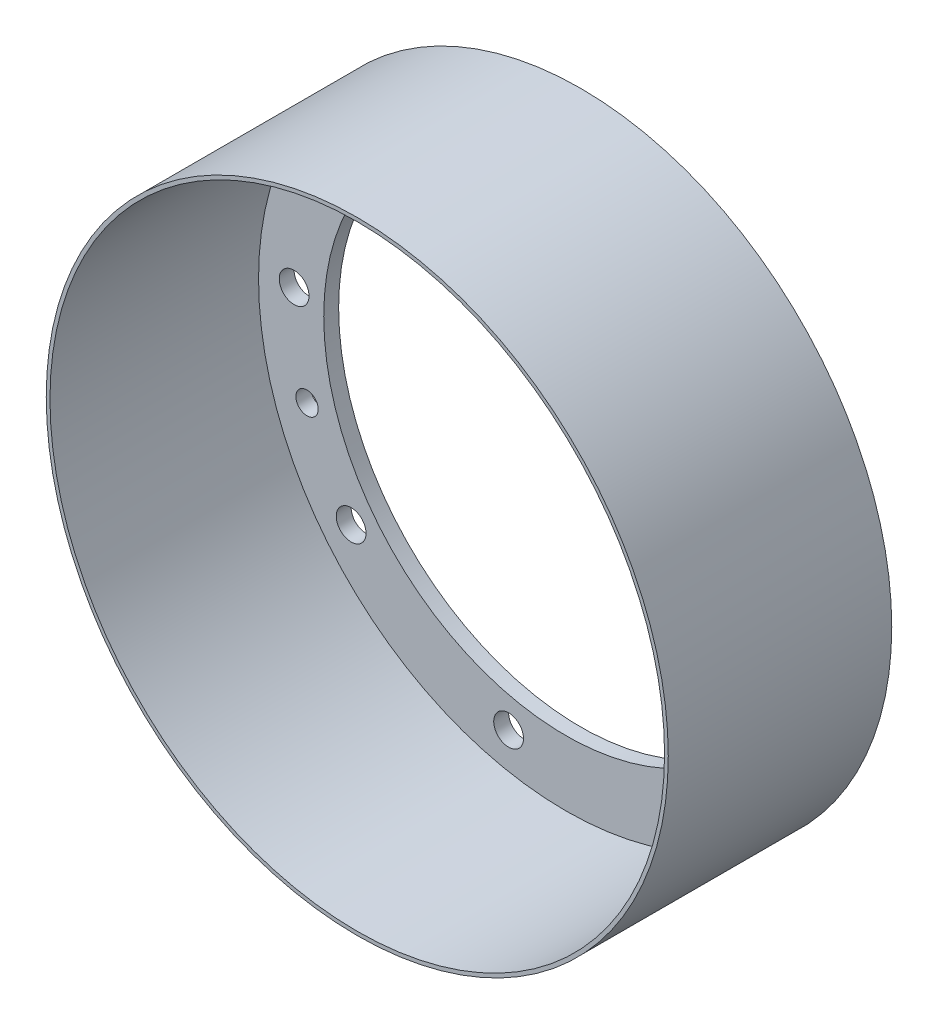
ISO-10303-21;
HEADER;
FILE_DESCRIPTION(('STEP AP214'),'2;1');
FILE_NAME('part.step','',(''),(''),'','','');
FILE_SCHEMA(('AUTOMOTIVE_DESIGN { 1 0 10303 214 1 1 1 1 }'));
ENDSEC;
DATA;
#1=APPLICATION_CONTEXT('core data for automotive mechanical design processes');
#2=APPLICATION_PROTOCOL_DEFINITION('international standard','automotive_design',2000,#1);
#3=PRODUCT_CONTEXT('',#1,'mechanical');
#4=PRODUCT('Part','Part','',(#3));
#5=PRODUCT_RELATED_PRODUCT_CATEGORY('part','',(#4));
#6=PRODUCT_DEFINITION_FORMATION('','',#4);
#7=PRODUCT_DEFINITION_CONTEXT('part definition',#1,'design');
#8=PRODUCT_DEFINITION('design','',#6,#7);
#9=PRODUCT_DEFINITION_SHAPE('','',#8);
#10=(LENGTH_UNIT() NAMED_UNIT(*) SI_UNIT(.MILLI.,.METRE.));
#11=(NAMED_UNIT(*) PLANE_ANGLE_UNIT() SI_UNIT($,.RADIAN.));
#12=(NAMED_UNIT(*) SI_UNIT($,.STERADIAN.) SOLID_ANGLE_UNIT());
#13=UNCERTAINTY_MEASURE_WITH_UNIT(LENGTH_MEASURE(1.E-05),#10,'distance_accuracy_value','');
#14=(GEOMETRIC_REPRESENTATION_CONTEXT(3) GLOBAL_UNCERTAINTY_ASSIGNED_CONTEXT((#13)) GLOBAL_UNIT_ASSIGNED_CONTEXT((#10,
#11,#12)) REPRESENTATION_CONTEXT('',''));
#15=CARTESIAN_POINT('',(0.,0.,0.));
#16=DIRECTION('',(0.,0.,1.));
#17=DIRECTION('',(1.,0.,0.));
#18=AXIS2_PLACEMENT_3D('',#15,#16,#17);
#19=CARTESIAN_POINT('',(-114.563267104504,-12.7195080926844,146.086832458153));
#20=DIRECTION('',(0.,0.,-1.));
#21=DIRECTION('',(-1.,0.,0.));
#22=AXIS2_PLACEMENT_3D('',#19,#20,#21);
#23=CYLINDRICAL_SURFACE('',#22,41.25);
#24=CARTESIAN_POINT('',(-114.563267104504,-12.7195080926844,28.));
#25=DIRECTION('',(0.,0.,-1.));
#26=DIRECTION('',(-1.,0.,0.));
#27=AXIS2_PLACEMENT_3D('',#24,#25,#26);
#28=CIRCLE('',#27,41.25);
#29=CARTESIAN_POINT('',(-155.813267104504,-12.7195080926844,28.));
#30=VERTEX_POINT('',#29);
#31=EDGE_CURVE('E10',#30,#30,#28,.T.);
#32=ORIENTED_EDGE('',*,*,#31,.F.);
#33=EDGE_LOOP('',(#32));
#34=FACE_BOUND('',#33,.T.);
#35=CARTESIAN_POINT('',(-114.563267104504,-12.7195080926844,0.));
#36=DIRECTION('',(0.,0.,1.));
#37=DIRECTION('',(1.,0.,0.));
#38=AXIS2_PLACEMENT_3D('',#35,#36,#37);
#39=CIRCLE('',#38,41.25);
#40=CARTESIAN_POINT('',(-73.3132671045038,-12.7195080926844,0.));
#41=VERTEX_POINT('',#40);
#42=EDGE_CURVE('E58',#41,#41,#39,.T.);
#43=ORIENTED_EDGE('',*,*,#42,.F.);
#44=EDGE_LOOP('',(#43));
#45=FACE_BOUND('',#44,.T.);
#46=ADVANCED_FACE('F50',(#34,#45),#23,.F.);
#47=CARTESIAN_POINT('',(-114.563267104504,-12.7195080926844,146.086832458153));
#48=DIRECTION('',(0.,0.,-1.));
#49=DIRECTION('',(-1.,0.,0.));
#50=AXIS2_PLACEMENT_3D('',#47,#48,#49);
#51=CYLINDRICAL_SURFACE('',#50,41.75);
#52=CARTESIAN_POINT('',(-114.563267104504,-12.7195080926844,28.));
#53=DIRECTION('',(0.,0.,-1.));
#54=DIRECTION('',(-1.,0.,0.));
#55=AXIS2_PLACEMENT_3D('',#52,#53,#54);
#56=CIRCLE('',#55,41.75);
#57=CARTESIAN_POINT('',(-156.313267104504,-12.7195080926844,28.));
#58=VERTEX_POINT('',#57);
#59=EDGE_CURVE('E49',#58,#58,#56,.T.);
#60=ORIENTED_EDGE('',*,*,#59,.T.);
#61=EDGE_LOOP('',(#60));
#62=FACE_BOUND('',#61,.T.);
#63=CARTESIAN_POINT('',(-114.563267104504,-12.7195080926844,-2.));
#64=DIRECTION('',(0.,0.,1.));
#65=DIRECTION('',(1.,0.,0.));
#66=AXIS2_PLACEMENT_3D('',#63,#64,#65);
#67=CIRCLE('',#66,41.75);
#68=CARTESIAN_POINT('',(-72.8132671045038,-12.7195080926844,-2.));
#69=VERTEX_POINT('',#68);
#70=EDGE_CURVE('E68',#69,#69,#67,.T.);
#71=ORIENTED_EDGE('',*,*,#70,.T.);
#72=EDGE_LOOP('',(#71));
#73=FACE_BOUND('',#72,.T.);
#74=ADVANCED_FACE('F205',(#62,#73),#51,.T.);
#75=CARTESIAN_POINT('',(-150.413026729424,-11.3740119628062,28.));
#76=DIRECTION('',(0.,0.,-1.));
#77=DIRECTION('',(-0.037505118602877,-0.999296435537816,0.));
#78=AXIS2_PLACEMENT_3D('',#75,#76,#77);
#79=PLANE('',#78);
#80=ORIENTED_EDGE('',*,*,#31,.T.);
#81=EDGE_LOOP('',(#80));
#82=FACE_BOUND('',#81,.T.);
#83=ORIENTED_EDGE('',*,*,#59,.F.);
#84=EDGE_LOOP('',(#83));
#85=FACE_BOUND('',#84,.T.);
#86=ADVANCED_FACE('F206',(#82,#85),#79,.F.);
#87=CARTESIAN_POINT('',(0.,0.,0.));
#88=DIRECTION('',(0.,0.,1.));
#89=DIRECTION('',(1.,0.,0.));
#90=AXIS2_PLACEMENT_3D('',#87,#88,#89);
#91=PLANE('',#90);
#92=CARTESIAN_POINT('',(-114.563267104504,-12.7195080926844,0.));
#93=DIRECTION('',(0.,0.,1.));
#94=DIRECTION('',(1.,0.,0.));
#95=AXIS2_PLACEMENT_3D('',#92,#93,#94);
#96=CIRCLE('',#95,32.5);
#97=CARTESIAN_POINT('',(-82.0632671045038,-12.7195080926844,0.));
#98=VERTEX_POINT('',#97);
#99=EDGE_CURVE('E65',#98,#98,#96,.T.);
#100=ORIENTED_EDGE('',*,*,#99,.F.);
#101=EDGE_LOOP('',(#100));
#102=FACE_BOUND('',#101,.T.);
#103=CARTESIAN_POINT('',(-106.881428320139,22.9629715421591,0.));
#104=DIRECTION('',(0.,0.,1.));
#105=DIRECTION('',(1.,0.,0.));
#106=AXIS2_PLACEMENT_3D('',#103,#104,#105);
#107=CIRCLE('',#106,1.50000000000004);
#108=CARTESIAN_POINT('',(-105.381428320139,22.9629715421591,0.));
#109=VERTEX_POINT('',#108);
#110=EDGE_CURVE('E121',#109,#109,#107,.T.);
#111=ORIENTED_EDGE('',*,*,#110,.F.);
#112=EDGE_LOOP('',(#111));
#113=FACE_BOUND('',#112,.T.);
#114=CARTESIAN_POINT('',(-87.5022526628918,-37.2134154451432,0.));
#115=DIRECTION('',(0.,0.,1.));
#116=DIRECTION('',(1.,0.,0.));
#117=AXIS2_PLACEMENT_3D('',#114,#115,#116);
#118=CIRCLE('',#117,1.50000000000004);
#119=CARTESIAN_POINT('',(-86.0022526628918,-37.2134154451432,0.));
#120=VERTEX_POINT('',#119);
#121=EDGE_CURVE('E122',#120,#120,#118,.T.);
#122=ORIENTED_EDGE('',*,*,#121,.F.);
#123=EDGE_LOOP('',(#122));
#124=FACE_BOUND('',#123,.T.);
#125=CARTESIAN_POINT('',(-149.306120330482,-23.9080803750691,0.));
#126=DIRECTION('',(0.,0.,1.));
#127=DIRECTION('',(1.,0.,0.));
#128=AXIS2_PLACEMENT_3D('',#125,#126,#127);
#129=CIRCLE('',#128,1.5);
#130=CARTESIAN_POINT('',(-147.806120330482,-23.9080803750691,0.));
#131=VERTEX_POINT('',#130);
#132=EDGE_CURVE('E120',#131,#131,#129,.T.);
#133=ORIENTED_EDGE('',*,*,#132,.F.);
#134=EDGE_LOOP('',(#133));
#135=FACE_BOUND('',#134,.T.);
#136=CARTESIAN_POINT('',(-141.624281546117,11.7743992597744,0.));
#137=DIRECTION('',(0.,0.,1.));
#138=DIRECTION('',(1.,0.,0.));
#139=AXIS2_PLACEMENT_3D('',#136,#137,#138);
#140=CIRCLE('',#139,2.00000000000003);
#141=CARTESIAN_POINT('',(-139.624281546117,11.7743992597744,0.));
#142=VERTEX_POINT('',#141);
#143=EDGE_CURVE('E113',#142,#142,#140,.T.);
#144=ORIENTED_EDGE('',*,*,#143,.F.);
#145=EDGE_LOOP('',(#144));
#146=FACE_BOUND('',#145,.T.);
#147=CARTESIAN_POINT('',(-119.548826683694,23.4383983135548,0.));
#148=DIRECTION('',(0.,0.,1.));
#149=DIRECTION('',(1.,0.,0.));
#150=AXIS2_PLACEMENT_3D('',#147,#148,#149);
#151=CIRCLE('',#150,1.99999999999998);
#152=CARTESIAN_POINT('',(-117.548826683694,23.4383983135548,0.));
#153=VERTEX_POINT('',#152);
#154=EDGE_CURVE('E107',#153,#153,#151,.T.);
#155=ORIENTED_EDGE('',*,*,#154,.F.);
#156=EDGE_LOOP('',(#155));
#157=FACE_BOUND('',#156,.T.);
#158=CARTESIAN_POINT('',(-151.037587001635,-11.3505712636794,0.));
#159=DIRECTION('',(0.,0.,1.));
#160=DIRECTION('',(1.,0.,0.));
#161=AXIS2_PLACEMENT_3D('',#158,#159,#160);
#162=CIRCLE('',#161,2.);
#163=CARTESIAN_POINT('',(-149.037587001635,-11.3505712636794,0.));
#164=VERTEX_POINT('',#163);
#165=EDGE_CURVE('E102',#164,#164,#162,.T.);
#166=ORIENTED_EDGE('',*,*,#165,.F.);
#167=EDGE_LOOP('',(#166));
#168=FACE_BOUND('',#167,.T.);
#169=CARTESIAN_POINT('',(-143.384152810373,-35.1160825434628,0.));
#170=DIRECTION('',(0.,0.,1.));
#171=DIRECTION('',(1.,0.,0.));
#172=AXIS2_PLACEMENT_3D('',#169,#170,#171);
#173=CIRCLE('',#172,2.00000000000003);
#174=CARTESIAN_POINT('',(-141.384152810373,-35.1160825434628,0.));
#175=VERTEX_POINT('',#174);
#176=EDGE_CURVE('E103',#175,#175,#173,.T.);
#177=ORIENTED_EDGE('',*,*,#176,.F.);
#178=EDGE_LOOP('',(#177));
#179=FACE_BOUND('',#178,.T.);
#180=CARTESIAN_POINT('',(-122.24510588887,-48.4019877275279,0.));
#181=DIRECTION('',(0.,0.,1.));
#182=DIRECTION('',(1.,0.,0.));
#183=AXIS2_PLACEMENT_3D('',#180,#181,#182);
#184=CIRCLE('',#183,1.99999999999998);
#185=CARTESIAN_POINT('',(-120.24510588887,-48.4019877275279,0.));
#186=VERTEX_POINT('',#185);
#187=EDGE_CURVE('E97',#186,#186,#184,.T.);
#188=ORIENTED_EDGE('',*,*,#187,.F.);
#189=EDGE_LOOP('',(#188));
#190=FACE_BOUND('',#189,.T.);
#191=CARTESIAN_POINT('',(-97.5116412260338,-44.9916641238619,0.));
#192=DIRECTION('',(0.,0.,1.));
#193=DIRECTION('',(1.,0.,0.));
#194=AXIS2_PLACEMENT_3D('',#191,#192,#193);
#195=CIRCLE('',#194,2.00000000000003);
#196=CARTESIAN_POINT('',(-95.5116412260337,-44.9916641238619,0.));
#197=VERTEX_POINT('',#196);
#198=EDGE_CURVE('E93',#197,#197,#195,.T.);
#199=ORIENTED_EDGE('',*,*,#198,.F.);
#200=EDGE_LOOP('',(#199));
#201=FACE_BOUND('',#200,.T.);
#202=CARTESIAN_POINT('',(-80.7568218194466,-26.4808400481452,0.));
#203=DIRECTION('',(0.,0.,1.));
#204=DIRECTION('',(1.,0.,0.));
#205=AXIS2_PLACEMENT_3D('',#202,#203,#204);
#206=CIRCLE('',#205,1.99999999999995);
#207=CARTESIAN_POINT('',(-78.7568218194467,-26.4808400481452,0.));
#208=VERTEX_POINT('',#207);
#209=EDGE_CURVE('E89',#208,#208,#206,.T.);
#210=ORIENTED_EDGE('',*,*,#209,.F.);
#211=EDGE_LOOP('',(#210));
#212=FACE_BOUND('',#211,.T.);
#213=CARTESIAN_POINT('',(-79.8204138785265,-1.53093581029968,0.));
#214=DIRECTION('',(0.,0.,1.));
#215=DIRECTION('',(1.,0.,0.));
#216=AXIS2_PLACEMENT_3D('',#213,#214,#215);
#217=CIRCLE('',#216,1.99999999999995);
#218=CARTESIAN_POINT('',(-77.8204138785265,-1.53093581029968,0.));
#219=VERTEX_POINT('',#218);
#220=EDGE_CURVE('E83',#219,#219,#217,.T.);
#221=ORIENTED_EDGE('',*,*,#220,.F.);
#222=EDGE_LOOP('',(#221));
#223=FACE_BOUND('',#222,.T.);
#224=CARTESIAN_POINT('',(-95.1405730858449,18.1837111094881,0.));
#225=DIRECTION('',(0.,0.,1.));
#226=DIRECTION('',(1.,0.,0.));
#227=AXIS2_PLACEMENT_3D('',#224,#225,#226);
#228=CIRCLE('',#227,2.00000000000003);
#229=CARTESIAN_POINT('',(-93.1405730858448,18.1837111094881,0.));
#230=VERTEX_POINT('',#229);
#231=EDGE_CURVE('E82',#230,#230,#228,.T.);
#232=ORIENTED_EDGE('',*,*,#231,.F.);
#233=EDGE_LOOP('',(#232));
#234=FACE_BOUND('',#233,.T.);
#235=ORIENTED_EDGE('',*,*,#42,.T.);
#236=EDGE_LOOP('',(#235));
#237=FACE_BOUND('',#236,.T.);
#238=ADVANCED_FACE('F196',(#102,#113,#124,#135,#146,#157,#168,#179,#190,#201,#212,#223,#234,
#237),#91,.T.);
#239=CARTESIAN_POINT('',(-114.563267104504,-12.7195080926844,-2.));
#240=DIRECTION('',(0.,0.,1.));
#241=DIRECTION('',(1.,0.,0.));
#242=AXIS2_PLACEMENT_3D('',#239,#240,#241);
#243=CYLINDRICAL_SURFACE('',#242,32.5);
#244=CARTESIAN_POINT('',(-114.563267104504,-12.7195080926844,-2.));
#245=DIRECTION('',(0.,0.,1.));
#246=DIRECTION('',(1.,0.,0.));
#247=AXIS2_PLACEMENT_3D('',#244,#245,#246);
#248=CIRCLE('',#247,32.5);
#249=CARTESIAN_POINT('',(-82.0632671045038,-12.7195080926844,-2.));
#250=VERTEX_POINT('',#249);
#251=EDGE_CURVE('E72',#250,#250,#248,.T.);
#252=ORIENTED_EDGE('',*,*,#251,.F.);
#253=EDGE_LOOP('',(#252));
#254=FACE_BOUND('',#253,.T.);
#255=ORIENTED_EDGE('',*,*,#99,.T.);
#256=EDGE_LOOP('',(#255));
#257=FACE_BOUND('',#256,.T.);
#258=ADVANCED_FACE('F186',(#254,#257),#243,.F.);
#259=CARTESIAN_POINT('',(-106.881428320139,22.9629715421591,-2.));
#260=DIRECTION('',(0.,0.,1.));
#261=DIRECTION('',(1.,0.,0.));
#262=AXIS2_PLACEMENT_3D('',#259,#260,#261);
#263=CYLINDRICAL_SURFACE('',#262,1.50000000000004);
#264=CARTESIAN_POINT('',(-106.881428320139,22.9629715421591,-2.));
#265=DIRECTION('',(0.,0.,1.));
#266=DIRECTION('',(1.,0.,0.));
#267=AXIS2_PLACEMENT_3D('',#264,#265,#266);
#268=CIRCLE('',#267,1.50000000000004);
#269=CARTESIAN_POINT('',(-105.381428320139,22.9629715421591,-2.));
#270=VERTEX_POINT('',#269);
#271=EDGE_CURVE('E80',#270,#270,#268,.T.);
#272=ORIENTED_EDGE('',*,*,#271,.F.);
#273=EDGE_LOOP('',(#272));
#274=FACE_BOUND('',#273,.T.);
#275=ORIENTED_EDGE('',*,*,#110,.T.);
#276=EDGE_LOOP('',(#275));
#277=FACE_BOUND('',#276,.T.);
#278=ADVANCED_FACE('F187',(#274,#277),#263,.F.);
#279=CARTESIAN_POINT('',(-87.5022526628918,-37.2134154451432,-2.));
#280=DIRECTION('',(0.,0.,1.));
#281=DIRECTION('',(1.,0.,0.));
#282=AXIS2_PLACEMENT_3D('',#279,#280,#281);
#283=CYLINDRICAL_SURFACE('',#282,1.50000000000004);
#284=CARTESIAN_POINT('',(-87.5022526628918,-37.2134154451432,-2.));
#285=DIRECTION('',(0.,0.,1.));
#286=DIRECTION('',(1.,0.,0.));
#287=AXIS2_PLACEMENT_3D('',#284,#285,#286);
#288=CIRCLE('',#287,1.50000000000004);
#289=CARTESIAN_POINT('',(-86.0022526628918,-37.2134154451432,-2.));
#290=VERTEX_POINT('',#289);
#291=EDGE_CURVE('E176',#290,#290,#288,.T.);
#292=ORIENTED_EDGE('',*,*,#291,.F.);
#293=EDGE_LOOP('',(#292));
#294=FACE_BOUND('',#293,.T.);
#295=ORIENTED_EDGE('',*,*,#121,.T.);
#296=EDGE_LOOP('',(#295));
#297=FACE_BOUND('',#296,.T.);
#298=ADVANCED_FACE('F189',(#294,#297),#283,.F.);
#299=CARTESIAN_POINT('',(-149.306120330482,-23.9080803750691,-2.));
#300=DIRECTION('',(0.,0.,1.));
#301=DIRECTION('',(1.,0.,0.));
#302=AXIS2_PLACEMENT_3D('',#299,#300,#301);
#303=CYLINDRICAL_SURFACE('',#302,1.5);
#304=CARTESIAN_POINT('',(-149.306120330482,-23.9080803750691,-2.));
#305=DIRECTION('',(0.,0.,1.));
#306=DIRECTION('',(1.,0.,0.));
#307=AXIS2_PLACEMENT_3D('',#304,#305,#306);
#308=CIRCLE('',#307,1.5);
#309=CARTESIAN_POINT('',(-147.806120330482,-23.9080803750691,-2.));
#310=VERTEX_POINT('',#309);
#311=EDGE_CURVE('E175',#310,#310,#308,.T.);
#312=ORIENTED_EDGE('',*,*,#311,.F.);
#313=EDGE_LOOP('',(#312));
#314=FACE_BOUND('',#313,.T.);
#315=ORIENTED_EDGE('',*,*,#132,.T.);
#316=EDGE_LOOP('',(#315));
#317=FACE_BOUND('',#316,.T.);
#318=ADVANCED_FACE('F193',(#314,#317),#303,.F.);
#319=CARTESIAN_POINT('',(-141.624281546117,11.7743992597744,-2.));
#320=DIRECTION('',(0.,0.,1.));
#321=DIRECTION('',(1.,0.,0.));
#322=AXIS2_PLACEMENT_3D('',#319,#320,#321);
#323=CYLINDRICAL_SURFACE('',#322,2.00000000000003);
#324=CARTESIAN_POINT('',(-141.624281546117,11.7743992597744,-2.));
#325=DIRECTION('',(0.,0.,1.));
#326=DIRECTION('',(1.,0.,0.));
#327=AXIS2_PLACEMENT_3D('',#324,#325,#326);
#328=CIRCLE('',#327,2.00000000000003);
#329=CARTESIAN_POINT('',(-139.624281546117,11.7743992597744,-2.));
#330=VERTEX_POINT('',#329);
#331=EDGE_CURVE('E166',#330,#330,#328,.T.);
#332=ORIENTED_EDGE('',*,*,#331,.F.);
#333=EDGE_LOOP('',(#332));
#334=FACE_BOUND('',#333,.T.);
#335=ORIENTED_EDGE('',*,*,#143,.T.);
#336=EDGE_LOOP('',(#335));
#337=FACE_BOUND('',#336,.T.);
#338=ADVANCED_FACE('F250',(#334,#337),#323,.F.);
#339=CARTESIAN_POINT('',(-119.548826683694,23.4383983135548,-2.));
#340=DIRECTION('',(0.,0.,1.));
#341=DIRECTION('',(1.,0.,0.));
#342=AXIS2_PLACEMENT_3D('',#339,#340,#341);
#343=CYLINDRICAL_SURFACE('',#342,1.99999999999998);
#344=CARTESIAN_POINT('',(-119.548826683694,23.4383983135548,-2.));
#345=DIRECTION('',(0.,0.,1.));
#346=DIRECTION('',(1.,0.,0.));
#347=AXIS2_PLACEMENT_3D('',#344,#345,#346);
#348=CIRCLE('',#347,1.99999999999998);
#349=CARTESIAN_POINT('',(-117.548826683694,23.4383983135548,-2.));
#350=VERTEX_POINT('',#349);
#351=EDGE_CURVE('E165',#350,#350,#348,.T.);
#352=ORIENTED_EDGE('',*,*,#351,.F.);
#353=EDGE_LOOP('',(#352));
#354=FACE_BOUND('',#353,.T.);
#355=ORIENTED_EDGE('',*,*,#154,.T.);
#356=EDGE_LOOP('',(#355));
#357=FACE_BOUND('',#356,.T.);
#358=ADVANCED_FACE('F243',(#354,#357),#343,.F.);
#359=CARTESIAN_POINT('',(-151.037587001635,-11.3505712636794,-2.));
#360=DIRECTION('',(0.,0.,1.));
#361=DIRECTION('',(1.,0.,0.));
#362=AXIS2_PLACEMENT_3D('',#359,#360,#361);
#363=CYLINDRICAL_SURFACE('',#362,2.);
#364=CARTESIAN_POINT('',(-151.037587001635,-11.3505712636794,-2.));
#365=DIRECTION('',(0.,0.,1.));
#366=DIRECTION('',(1.,0.,0.));
#367=AXIS2_PLACEMENT_3D('',#364,#365,#366);
#368=CIRCLE('',#367,2.);
#369=CARTESIAN_POINT('',(-149.037587001635,-11.3505712636794,-2.));
#370=VERTEX_POINT('',#369);
#371=EDGE_CURVE('E156',#370,#370,#368,.T.);
#372=ORIENTED_EDGE('',*,*,#371,.F.);
#373=EDGE_LOOP('',(#372));
#374=FACE_BOUND('',#373,.T.);
#375=ORIENTED_EDGE('',*,*,#165,.T.);
#376=EDGE_LOOP('',(#375));
#377=FACE_BOUND('',#376,.T.);
#378=ADVANCED_FACE('F237',(#374,#377),#363,.F.);
#379=CARTESIAN_POINT('',(-143.384152810373,-35.1160825434628,-2.));
#380=DIRECTION('',(0.,0.,1.));
#381=DIRECTION('',(1.,0.,0.));
#382=AXIS2_PLACEMENT_3D('',#379,#380,#381);
#383=CYLINDRICAL_SURFACE('',#382,2.00000000000003);
#384=CARTESIAN_POINT('',(-143.384152810373,-35.1160825434628,-2.));
#385=DIRECTION('',(0.,0.,1.));
#386=DIRECTION('',(1.,0.,0.));
#387=AXIS2_PLACEMENT_3D('',#384,#385,#386);
#388=CIRCLE('',#387,2.00000000000003);
#389=CARTESIAN_POINT('',(-141.384152810373,-35.1160825434628,-2.));
#390=VERTEX_POINT('',#389);
#391=EDGE_CURVE('E157',#390,#390,#388,.T.);
#392=ORIENTED_EDGE('',*,*,#391,.F.);
#393=EDGE_LOOP('',(#392));
#394=FACE_BOUND('',#393,.T.);
#395=ORIENTED_EDGE('',*,*,#176,.T.);
#396=EDGE_LOOP('',(#395));
#397=FACE_BOUND('',#396,.T.);
#398=ADVANCED_FACE('F232',(#394,#397),#383,.F.);
#399=CARTESIAN_POINT('',(-122.24510588887,-48.4019877275279,-2.));
#400=DIRECTION('',(0.,0.,1.));
#401=DIRECTION('',(1.,0.,0.));
#402=AXIS2_PLACEMENT_3D('',#399,#400,#401);
#403=CYLINDRICAL_SURFACE('',#402,1.99999999999998);
#404=CARTESIAN_POINT('',(-122.24510588887,-48.4019877275279,-2.));
#405=DIRECTION('',(0.,0.,1.));
#406=DIRECTION('',(1.,0.,0.));
#407=AXIS2_PLACEMENT_3D('',#404,#405,#406);
#408=CIRCLE('',#407,1.99999999999998);
#409=CARTESIAN_POINT('',(-120.24510588887,-48.4019877275279,-2.));
#410=VERTEX_POINT('',#409);
#411=EDGE_CURVE('E155',#410,#410,#408,.T.);
#412=ORIENTED_EDGE('',*,*,#411,.F.);
#413=EDGE_LOOP('',(#412));
#414=FACE_BOUND('',#413,.T.);
#415=ORIENTED_EDGE('',*,*,#187,.T.);
#416=EDGE_LOOP('',(#415));
#417=FACE_BOUND('',#416,.T.);
#418=ADVANCED_FACE('F233',(#414,#417),#403,.F.);
#419=CARTESIAN_POINT('',(-97.5116412260338,-44.9916641238619,-2.));
#420=DIRECTION('',(0.,0.,1.));
#421=DIRECTION('',(1.,0.,0.));
#422=AXIS2_PLACEMENT_3D('',#419,#420,#421);
#423=CYLINDRICAL_SURFACE('',#422,2.00000000000003);
#424=CARTESIAN_POINT('',(-97.5116412260338,-44.9916641238619,-2.));
#425=DIRECTION('',(0.,0.,1.));
#426=DIRECTION('',(1.,0.,0.));
#427=AXIS2_PLACEMENT_3D('',#424,#425,#426);
#428=CIRCLE('',#427,2.00000000000003);
#429=CARTESIAN_POINT('',(-95.5116412260337,-44.9916641238619,-2.));
#430=VERTEX_POINT('',#429);
#431=EDGE_CURVE('E149',#430,#430,#428,.T.);
#432=ORIENTED_EDGE('',*,*,#431,.F.);
#433=EDGE_LOOP('',(#432));
#434=FACE_BOUND('',#433,.T.);
#435=ORIENTED_EDGE('',*,*,#198,.T.);
#436=EDGE_LOOP('',(#435));
#437=FACE_BOUND('',#436,.T.);
#438=ADVANCED_FACE('F227',(#434,#437),#423,.F.);
#439=CARTESIAN_POINT('',(-80.7568218194466,-26.4808400481452,-2.));
#440=DIRECTION('',(0.,0.,1.));
#441=DIRECTION('',(1.,0.,0.));
#442=AXIS2_PLACEMENT_3D('',#439,#440,#441);
#443=CYLINDRICAL_SURFACE('',#442,1.99999999999995);
#444=CARTESIAN_POINT('',(-80.7568218194466,-26.4808400481452,-2.));
#445=DIRECTION('',(0.,0.,1.));
#446=DIRECTION('',(1.,0.,0.));
#447=AXIS2_PLACEMENT_3D('',#444,#445,#446);
#448=CIRCLE('',#447,1.99999999999995);
#449=CARTESIAN_POINT('',(-78.7568218194467,-26.4808400481452,-2.));
#450=VERTEX_POINT('',#449);
#451=EDGE_CURVE('E145',#450,#450,#448,.T.);
#452=ORIENTED_EDGE('',*,*,#451,.F.);
#453=EDGE_LOOP('',(#452));
#454=FACE_BOUND('',#453,.T.);
#455=ORIENTED_EDGE('',*,*,#209,.T.);
#456=EDGE_LOOP('',(#455));
#457=FACE_BOUND('',#456,.T.);
#458=ADVANCED_FACE('F223',(#454,#457),#443,.F.);
#459=CARTESIAN_POINT('',(-79.8204138785265,-1.53093581029968,-2.));
#460=DIRECTION('',(0.,0.,1.));
#461=DIRECTION('',(1.,0.,0.));
#462=AXIS2_PLACEMENT_3D('',#459,#460,#461);
#463=CYLINDRICAL_SURFACE('',#462,1.99999999999995);
#464=CARTESIAN_POINT('',(-79.8204138785265,-1.53093581029968,-2.));
#465=DIRECTION('',(0.,0.,1.));
#466=DIRECTION('',(1.,0.,0.));
#467=AXIS2_PLACEMENT_3D('',#464,#465,#466);
#468=CIRCLE('',#467,1.99999999999995);
#469=CARTESIAN_POINT('',(-77.8204138785265,-1.53093581029968,-2.));
#470=VERTEX_POINT('',#469);
#471=EDGE_CURVE('E137',#470,#470,#468,.T.);
#472=ORIENTED_EDGE('',*,*,#471,.F.);
#473=EDGE_LOOP('',(#472));
#474=FACE_BOUND('',#473,.T.);
#475=ORIENTED_EDGE('',*,*,#220,.T.);
#476=EDGE_LOOP('',(#475));
#477=FACE_BOUND('',#476,.T.);
#478=ADVANCED_FACE('F219',(#474,#477),#463,.F.);
#479=CARTESIAN_POINT('',(-95.1405730858449,18.1837111094881,-2.));
#480=DIRECTION('',(0.,0.,1.));
#481=DIRECTION('',(1.,0.,0.));
#482=AXIS2_PLACEMENT_3D('',#479,#480,#481);
#483=CYLINDRICAL_SURFACE('',#482,2.00000000000003);
#484=CARTESIAN_POINT('',(-95.1405730858449,18.1837111094881,-2.));
#485=DIRECTION('',(0.,0.,1.));
#486=DIRECTION('',(1.,0.,0.));
#487=AXIS2_PLACEMENT_3D('',#484,#485,#486);
#488=CIRCLE('',#487,2.00000000000003);
#489=CARTESIAN_POINT('',(-93.1405730858448,18.1837111094881,-2.));
#490=VERTEX_POINT('',#489);
#491=EDGE_CURVE('E133',#490,#490,#488,.T.);
#492=ORIENTED_EDGE('',*,*,#491,.F.);
#493=EDGE_LOOP('',(#492));
#494=FACE_BOUND('',#493,.T.);
#495=ORIENTED_EDGE('',*,*,#231,.T.);
#496=EDGE_LOOP('',(#495));
#497=FACE_BOUND('',#496,.T.);
#498=ADVANCED_FACE('F218',(#494,#497),#483,.F.);
#499=CARTESIAN_POINT('',(0.,0.,-2.));
#500=DIRECTION('',(0.,0.,1.));
#501=DIRECTION('',(1.,0.,0.));
#502=AXIS2_PLACEMENT_3D('',#499,#500,#501);
#503=PLANE('',#502);
#504=ORIENTED_EDGE('',*,*,#491,.T.);
#505=EDGE_LOOP('',(#504));
#506=FACE_BOUND('',#505,.T.);
#507=ORIENTED_EDGE('',*,*,#471,.T.);
#508=EDGE_LOOP('',(#507));
#509=FACE_BOUND('',#508,.T.);
#510=ORIENTED_EDGE('',*,*,#451,.T.);
#511=EDGE_LOOP('',(#510));
#512=FACE_BOUND('',#511,.T.);
#513=ORIENTED_EDGE('',*,*,#431,.T.);
#514=EDGE_LOOP('',(#513));
#515=FACE_BOUND('',#514,.T.);
#516=ORIENTED_EDGE('',*,*,#411,.T.);
#517=EDGE_LOOP('',(#516));
#518=FACE_BOUND('',#517,.T.);
#519=ORIENTED_EDGE('',*,*,#391,.T.);
#520=EDGE_LOOP('',(#519));
#521=FACE_BOUND('',#520,.T.);
#522=ORIENTED_EDGE('',*,*,#371,.T.);
#523=EDGE_LOOP('',(#522));
#524=FACE_BOUND('',#523,.T.);
#525=ORIENTED_EDGE('',*,*,#351,.T.);
#526=EDGE_LOOP('',(#525));
#527=FACE_BOUND('',#526,.T.);
#528=ORIENTED_EDGE('',*,*,#331,.T.);
#529=EDGE_LOOP('',(#528));
#530=FACE_BOUND('',#529,.T.);
#531=ORIENTED_EDGE('',*,*,#311,.T.);
#532=EDGE_LOOP('',(#531));
#533=FACE_BOUND('',#532,.T.);
#534=ORIENTED_EDGE('',*,*,#291,.T.);
#535=EDGE_LOOP('',(#534));
#536=FACE_BOUND('',#535,.T.);
#537=ORIENTED_EDGE('',*,*,#271,.T.);
#538=EDGE_LOOP('',(#537));
#539=FACE_BOUND('',#538,.T.);
#540=ORIENTED_EDGE('',*,*,#251,.T.);
#541=EDGE_LOOP('',(#540));
#542=FACE_BOUND('',#541,.T.);
#543=ORIENTED_EDGE('',*,*,#70,.F.);
#544=EDGE_LOOP('',(#543));
#545=FACE_BOUND('',#544,.T.);
#546=ADVANCED_FACE('F182',(#506,#509,#512,#515,#518,#521,#524,#527,#530,#533,#536,#539,#542,
#545),#503,.F.);
#547=CLOSED_SHELL('',(#46,#74,#86,#238,#258,#278,#298,#318,#338,#358,#378,#398,#418,#438,#458,
#478,#498,#546));
#548=MANIFOLD_SOLID_BREP('B2',#547);
#549=ADVANCED_BREP_SHAPE_REPRESENTATION('',(#18,#548),#14);
#550=SHAPE_DEFINITION_REPRESENTATION(#9,#549);
ENDSEC;
END-ISO-10303-21;
